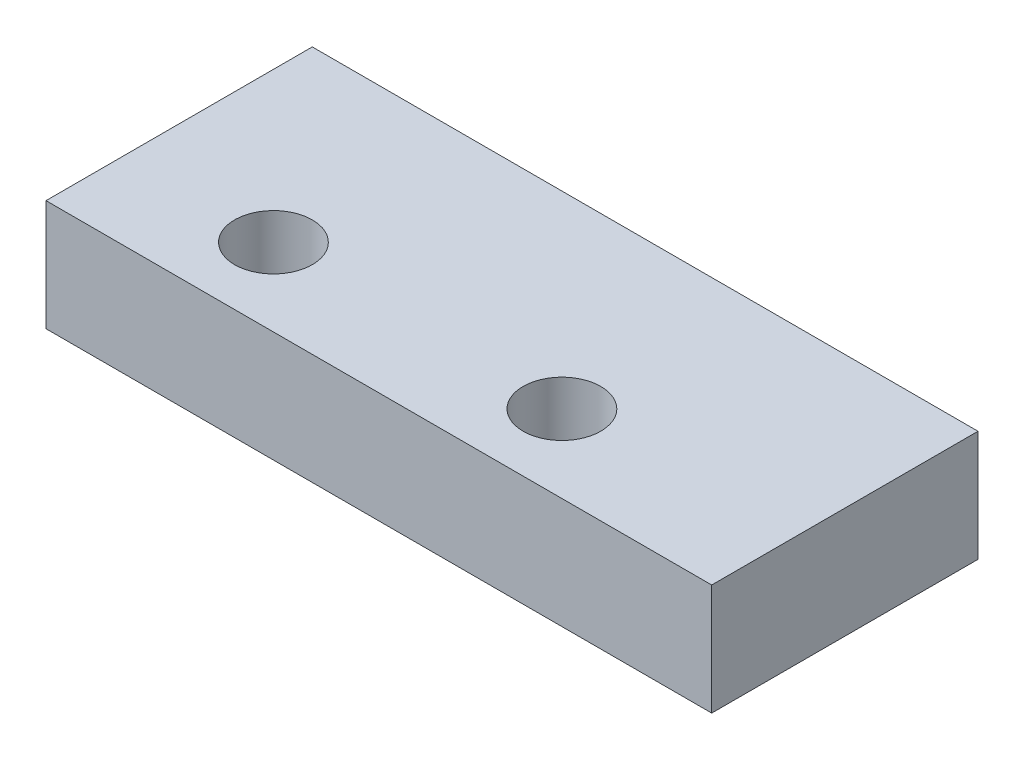
ISO-10303-21;
HEADER;
FILE_DESCRIPTION(('STEP AP214'),'2;1');
FILE_NAME('part.step','',(''),(''),'','','');
FILE_SCHEMA(('AUTOMOTIVE_DESIGN { 1 0 10303 214 1 1 1 1 }'));
ENDSEC;
DATA;
#1=APPLICATION_CONTEXT('core data for automotive mechanical design processes');
#2=APPLICATION_PROTOCOL_DEFINITION('international standard','automotive_design',2000,#1);
#3=PRODUCT_CONTEXT('',#1,'mechanical');
#4=PRODUCT('Part','Part','',(#3));
#5=PRODUCT_RELATED_PRODUCT_CATEGORY('part','',(#4));
#6=PRODUCT_DEFINITION_FORMATION('','',#4);
#7=PRODUCT_DEFINITION_CONTEXT('part definition',#1,'design');
#8=PRODUCT_DEFINITION('design','',#6,#7);
#9=PRODUCT_DEFINITION_SHAPE('','',#8);
#10=(LENGTH_UNIT() NAMED_UNIT(*) SI_UNIT(.MILLI.,.METRE.));
#11=(NAMED_UNIT(*) PLANE_ANGLE_UNIT() SI_UNIT($,.RADIAN.));
#12=(NAMED_UNIT(*) SI_UNIT($,.STERADIAN.) SOLID_ANGLE_UNIT());
#13=UNCERTAINTY_MEASURE_WITH_UNIT(LENGTH_MEASURE(1.E-05),#10,'distance_accuracy_value','');
#14=(GEOMETRIC_REPRESENTATION_CONTEXT(3) GLOBAL_UNCERTAINTY_ASSIGNED_CONTEXT((#13)) GLOBAL_UNIT_ASSIGNED_CONTEXT((#10,
#11,#12)) REPRESENTATION_CONTEXT('',''));
#15=CARTESIAN_POINT('',(0.,0.,0.));
#16=DIRECTION('',(0.,0.,1.));
#17=DIRECTION('',(1.,0.,0.));
#18=AXIS2_PLACEMENT_3D('',#15,#16,#17);
#19=CARTESIAN_POINT('',(30.,10.,12.));
#20=DIRECTION('',(-1.,0.,0.));
#21=DIRECTION('',(0.,0.,1.));
#22=AXIS2_PLACEMENT_3D('',#19,#20,#21);
#23=PLANE('',#22);
#24=DIRECTION('',(0.,0.,-1.));
#25=VECTOR('',#24,1.);
#26=CARTESIAN_POINT('',(30.,0.,12.));
#27=LINE('',#26,#25);
#28=CARTESIAN_POINT('',(30.,0.,12.));
#29=VERTEX_POINT('',#28);
#30=CARTESIAN_POINT('',(30.,0.,-12.));
#31=VERTEX_POINT('',#30);
#32=EDGE_CURVE('E80',#29,#31,#27,.T.);
#33=ORIENTED_EDGE('',*,*,#32,.T.);
#34=DIRECTION('',(0.,-1.,0.));
#35=VECTOR('',#34,1.);
#36=CARTESIAN_POINT('',(30.,10.,-12.));
#37=LINE('',#36,#35);
#38=CARTESIAN_POINT('',(30.,10.,-12.));
#39=VERTEX_POINT('',#38);
#40=EDGE_CURVE('E11',#39,#31,#37,.T.);
#41=ORIENTED_EDGE('',*,*,#40,.F.);
#42=DIRECTION('',(0.,0.,-1.));
#43=VECTOR('',#42,1.);
#44=CARTESIAN_POINT('',(30.,10.,12.));
#45=LINE('',#44,#43);
#46=CARTESIAN_POINT('',(30.,10.,12.));
#47=VERTEX_POINT('',#46);
#48=EDGE_CURVE('E68',#47,#39,#45,.T.);
#49=ORIENTED_EDGE('',*,*,#48,.F.);
#50=DIRECTION('',(0.,-1.,0.));
#51=VECTOR('',#50,1.);
#52=CARTESIAN_POINT('',(30.,10.,12.));
#53=LINE('',#52,#51);
#54=EDGE_CURVE('E76',#47,#29,#53,.T.);
#55=ORIENTED_EDGE('',*,*,#54,.T.);
#56=EDGE_LOOP('',(#33,#41,#49,#55));
#57=FACE_BOUND('',#56,.T.);
#58=ADVANCED_FACE('F17',(#57),#23,.F.);
#59=CARTESIAN_POINT('',(-30.,10.,-12.));
#60=DIRECTION('',(0.,0.,1.));
#61=DIRECTION('',(1.,0.,0.));
#62=AXIS2_PLACEMENT_3D('',#59,#60,#61);
#63=PLANE('',#62);
#64=DIRECTION('',(-1.,0.,0.));
#65=VECTOR('',#64,1.);
#66=CARTESIAN_POINT('',(-30.,0.,-12.));
#67=LINE('',#66,#65);
#68=CARTESIAN_POINT('',(-30.,0.,-12.));
#69=VERTEX_POINT('',#68);
#70=EDGE_CURVE('E72',#31,#69,#67,.T.);
#71=ORIENTED_EDGE('',*,*,#70,.T.);
#72=DIRECTION('',(0.,-1.,0.));
#73=VECTOR('',#72,1.);
#74=CARTESIAN_POINT('',(-30.,10.,-12.));
#75=LINE('',#74,#73);
#76=CARTESIAN_POINT('',(-30.,10.,-12.));
#77=VERTEX_POINT('',#76);
#78=EDGE_CURVE('E25',#77,#69,#75,.T.);
#79=ORIENTED_EDGE('',*,*,#78,.F.);
#80=DIRECTION('',(-1.,0.,0.));
#81=VECTOR('',#80,1.);
#82=CARTESIAN_POINT('',(-30.,10.,-12.));
#83=LINE('',#82,#81);
#84=EDGE_CURVE('E63',#39,#77,#83,.T.);
#85=ORIENTED_EDGE('',*,*,#84,.F.);
#86=ORIENTED_EDGE('',*,*,#40,.T.);
#87=EDGE_LOOP('',(#71,#79,#85,#86));
#88=FACE_BOUND('',#87,.T.);
#89=ADVANCED_FACE('F71',(#88),#63,.F.);
#90=CARTESIAN_POINT('',(-30.,10.,12.));
#91=DIRECTION('',(1.,0.,0.));
#92=DIRECTION('',(0.,0.,-1.));
#93=AXIS2_PLACEMENT_3D('',#90,#91,#92);
#94=PLANE('',#93);
#95=DIRECTION('',(0.,0.,1.));
#96=VECTOR('',#95,1.);
#97=CARTESIAN_POINT('',(-30.,0.,12.));
#98=LINE('',#97,#96);
#99=CARTESIAN_POINT('',(-30.,0.,12.));
#100=VERTEX_POINT('',#99);
#101=EDGE_CURVE('E50',#69,#100,#98,.T.);
#102=ORIENTED_EDGE('',*,*,#101,.T.);
#103=DIRECTION('',(0.,-1.,0.));
#104=VECTOR('',#103,1.);
#105=CARTESIAN_POINT('',(-30.,10.,12.));
#106=LINE('',#105,#104);
#107=CARTESIAN_POINT('',(-30.,10.,12.));
#108=VERTEX_POINT('',#107);
#109=EDGE_CURVE('E73',#108,#100,#106,.T.);
#110=ORIENTED_EDGE('',*,*,#109,.F.);
#111=DIRECTION('',(0.,0.,1.));
#112=VECTOR('',#111,1.);
#113=CARTESIAN_POINT('',(-30.,10.,12.));
#114=LINE('',#113,#112);
#115=EDGE_CURVE('E66',#77,#108,#114,.T.);
#116=ORIENTED_EDGE('',*,*,#115,.F.);
#117=ORIENTED_EDGE('',*,*,#78,.T.);
#118=EDGE_LOOP('',(#102,#110,#116,#117));
#119=FACE_BOUND('',#118,.T.);
#120=ADVANCED_FACE('F74',(#119),#94,.F.);
#121=CARTESIAN_POINT('',(-30.,10.,12.));
#122=DIRECTION('',(0.,0.,-1.));
#123=DIRECTION('',(-1.,0.,0.));
#124=AXIS2_PLACEMENT_3D('',#121,#122,#123);
#125=PLANE('',#124);
#126=DIRECTION('',(1.,0.,0.));
#127=VECTOR('',#126,1.);
#128=CARTESIAN_POINT('',(-30.,0.,12.));
#129=LINE('',#128,#127);
#130=EDGE_CURVE('E56',#100,#29,#129,.T.);
#131=ORIENTED_EDGE('',*,*,#130,.T.);
#132=ORIENTED_EDGE('',*,*,#54,.F.);
#133=DIRECTION('',(1.,0.,0.));
#134=VECTOR('',#133,1.);
#135=CARTESIAN_POINT('',(-30.,10.,12.));
#136=LINE('',#135,#134);
#137=EDGE_CURVE('E33',#108,#47,#136,.T.);
#138=ORIENTED_EDGE('',*,*,#137,.F.);
#139=ORIENTED_EDGE('',*,*,#109,.T.);
#140=EDGE_LOOP('',(#131,#132,#138,#139));
#141=FACE_BOUND('',#140,.T.);
#142=ADVANCED_FACE('F88',(#141),#125,.F.);
#143=CARTESIAN_POINT('',(0.,10.,0.));
#144=DIRECTION('',(0.,-1.,0.));
#145=DIRECTION('',(0.,0.,-1.));
#146=AXIS2_PLACEMENT_3D('',#143,#144,#145);
#147=PLANE('',#146);
#148=CARTESIAN_POINT('',(-16.5,10.,5.));
#149=DIRECTION('',(0.,1.,0.));
#150=DIRECTION('',(0.,0.,1.));
#151=AXIS2_PLACEMENT_3D('',#148,#149,#150);
#152=CIRCLE('',#151,3.5);
#153=CARTESIAN_POINT('',(-16.5,10.,8.5));
#154=VERTEX_POINT('',#153);
#155=EDGE_CURVE('E102',#154,#154,#152,.T.);
#156=ORIENTED_EDGE('',*,*,#155,.F.);
#157=EDGE_LOOP('',(#156));
#158=FACE_BOUND('',#157,.T.);
#159=CARTESIAN_POINT('',(9.5,10.,5.));
#160=DIRECTION('',(0.,1.,0.));
#161=DIRECTION('',(0.,0.,1.));
#162=AXIS2_PLACEMENT_3D('',#159,#160,#161);
#163=CIRCLE('',#162,3.5);
#164=CARTESIAN_POINT('',(9.5,10.,8.5));
#165=VERTEX_POINT('',#164);
#166=EDGE_CURVE('E96',#165,#165,#163,.T.);
#167=ORIENTED_EDGE('',*,*,#166,.F.);
#168=EDGE_LOOP('',(#167));
#169=FACE_BOUND('',#168,.T.);
#170=ORIENTED_EDGE('',*,*,#48,.T.);
#171=ORIENTED_EDGE('',*,*,#84,.T.);
#172=ORIENTED_EDGE('',*,*,#115,.T.);
#173=ORIENTED_EDGE('',*,*,#137,.T.);
#174=EDGE_LOOP('',(#170,#171,#172,#173));
#175=FACE_BOUND('',#174,.T.);
#176=ADVANCED_FACE('F64',(#158,#169,#175),#147,.F.);
#177=CARTESIAN_POINT('',(0.,0.,0.));
#178=DIRECTION('',(0.,-1.,0.));
#179=DIRECTION('',(0.,0.,-1.));
#180=AXIS2_PLACEMENT_3D('',#177,#178,#179);
#181=PLANE('',#180);
#182=CARTESIAN_POINT('',(-16.5,0.,5.));
#183=DIRECTION('',(0.,1.,0.));
#184=DIRECTION('',(0.,0.,1.));
#185=AXIS2_PLACEMENT_3D('',#182,#183,#184);
#186=CIRCLE('',#185,3.5);
#187=CARTESIAN_POINT('',(-16.5,0.,8.5));
#188=VERTEX_POINT('',#187);
#189=EDGE_CURVE('E99',#188,#188,#186,.T.);
#190=ORIENTED_EDGE('',*,*,#189,.T.);
#191=EDGE_LOOP('',(#190));
#192=FACE_BOUND('',#191,.T.);
#193=CARTESIAN_POINT('',(9.5,0.,5.));
#194=DIRECTION('',(0.,1.,0.));
#195=DIRECTION('',(0.,0.,1.));
#196=AXIS2_PLACEMENT_3D('',#193,#194,#195);
#197=CIRCLE('',#196,3.5);
#198=CARTESIAN_POINT('',(9.5,0.,8.5));
#199=VERTEX_POINT('',#198);
#200=EDGE_CURVE('E83',#199,#199,#197,.T.);
#201=ORIENTED_EDGE('',*,*,#200,.T.);
#202=EDGE_LOOP('',(#201));
#203=FACE_BOUND('',#202,.T.);
#204=ORIENTED_EDGE('',*,*,#32,.F.);
#205=ORIENTED_EDGE('',*,*,#130,.F.);
#206=ORIENTED_EDGE('',*,*,#101,.F.);
#207=ORIENTED_EDGE('',*,*,#70,.F.);
#208=EDGE_LOOP('',(#204,#205,#206,#207));
#209=FACE_BOUND('',#208,.T.);
#210=ADVANCED_FACE('F91',(#192,#203,#209),#181,.T.);
#211=CARTESIAN_POINT('',(9.5,10.,5.));
#212=DIRECTION('',(0.,1.,0.));
#213=DIRECTION('',(0.,0.,1.));
#214=AXIS2_PLACEMENT_3D('',#211,#212,#213);
#215=CYLINDRICAL_SURFACE('',#214,3.5);
#216=ORIENTED_EDGE('',*,*,#200,.F.);
#217=EDGE_LOOP('',(#216));
#218=FACE_BOUND('',#217,.T.);
#219=ORIENTED_EDGE('',*,*,#166,.T.);
#220=EDGE_LOOP('',(#219));
#221=FACE_BOUND('',#220,.T.);
#222=ADVANCED_FACE('F113',(#218,#221),#215,.F.);
#223=CARTESIAN_POINT('',(-16.5,10.,5.));
#224=DIRECTION('',(0.,1.,0.));
#225=DIRECTION('',(0.,0.,1.));
#226=AXIS2_PLACEMENT_3D('',#223,#224,#225);
#227=CYLINDRICAL_SURFACE('',#226,3.5);
#228=ORIENTED_EDGE('',*,*,#189,.F.);
#229=EDGE_LOOP('',(#228));
#230=FACE_BOUND('',#229,.T.);
#231=ORIENTED_EDGE('',*,*,#155,.T.);
#232=EDGE_LOOP('',(#231));
#233=FACE_BOUND('',#232,.T.);
#234=ADVANCED_FACE('F106',(#230,#233),#227,.F.);
#235=CLOSED_SHELL('',(#58,#89,#120,#142,#176,#210,#222,#234));
#236=MANIFOLD_SOLID_BREP('B1',#235);
#237=ADVANCED_BREP_SHAPE_REPRESENTATION('',(#18,#236),#14);
#238=SHAPE_DEFINITION_REPRESENTATION(#9,#237);
ENDSEC;
END-ISO-10303-21;
